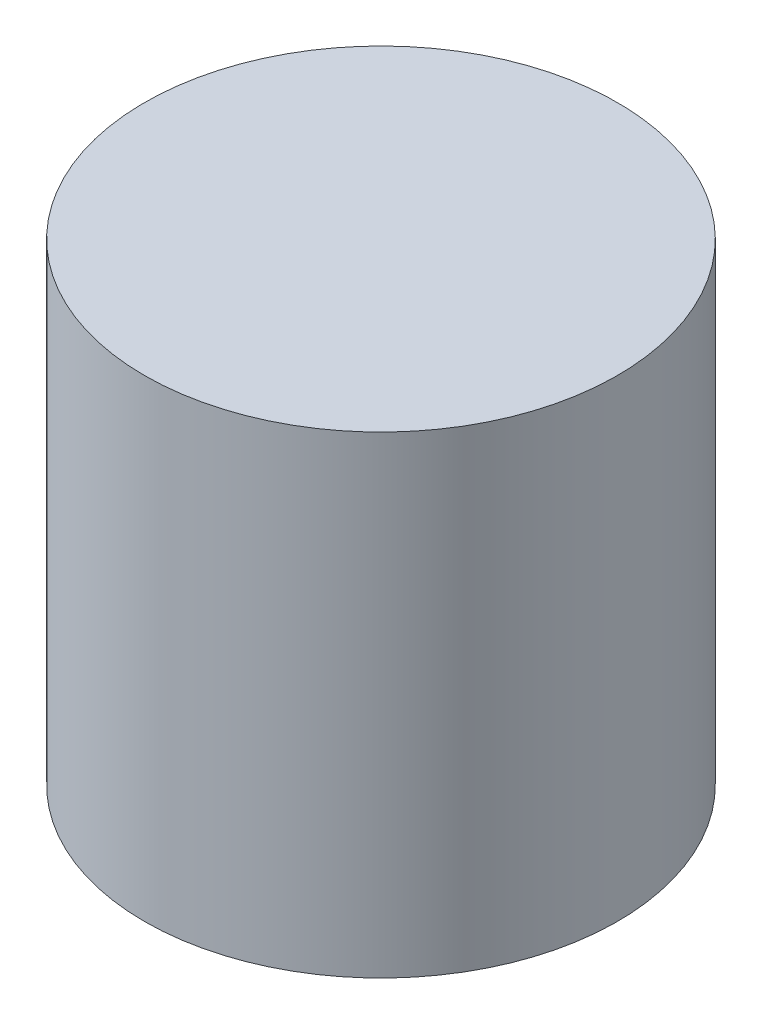
ISO-10303-21;
HEADER;
FILE_DESCRIPTION(('STEP AP214'),'2;1');
FILE_NAME('part.step','',(''),(''),'','','');
FILE_SCHEMA(('AUTOMOTIVE_DESIGN { 1 0 10303 214 1 1 1 1 }'));
ENDSEC;
DATA;
#1=APPLICATION_CONTEXT('core data for automotive mechanical design processes');
#2=APPLICATION_PROTOCOL_DEFINITION('international standard','automotive_design',2000,#1);
#3=PRODUCT_CONTEXT('',#1,'mechanical');
#4=PRODUCT('Part','Part','',(#3));
#5=PRODUCT_RELATED_PRODUCT_CATEGORY('part','',(#4));
#6=PRODUCT_DEFINITION_FORMATION('','',#4);
#7=PRODUCT_DEFINITION_CONTEXT('part definition',#1,'design');
#8=PRODUCT_DEFINITION('design','',#6,#7);
#9=PRODUCT_DEFINITION_SHAPE('','',#8);
#10=(LENGTH_UNIT() NAMED_UNIT(*) SI_UNIT(.MILLI.,.METRE.));
#11=(NAMED_UNIT(*) PLANE_ANGLE_UNIT() SI_UNIT($,.RADIAN.));
#12=(NAMED_UNIT(*) SI_UNIT($,.STERADIAN.) SOLID_ANGLE_UNIT());
#13=UNCERTAINTY_MEASURE_WITH_UNIT(LENGTH_MEASURE(1.E-05),#10,'distance_accuracy_value','');
#14=(GEOMETRIC_REPRESENTATION_CONTEXT(3) GLOBAL_UNCERTAINTY_ASSIGNED_CONTEXT((#13)) GLOBAL_UNIT_ASSIGNED_CONTEXT((#10,
#11,#12)) REPRESENTATION_CONTEXT('',''));
#15=CARTESIAN_POINT('',(0.,0.,0.));
#16=DIRECTION('',(0.,0.,1.));
#17=DIRECTION('',(1.,0.,0.));
#18=AXIS2_PLACEMENT_3D('',#15,#16,#17);
#19=CARTESIAN_POINT('',(0.,0.,0.));
#20=DIRECTION('',(0.,1.,0.));
#21=DIRECTION('',(0.,0.,1.));
#22=AXIS2_PLACEMENT_3D('',#19,#20,#21);
#23=PLANE('',#22);
#24=CARTESIAN_POINT('',(0.,0.,0.));
#25=DIRECTION('',(0.,1.,0.));
#26=DIRECTION('',(0.,0.,1.));
#27=AXIS2_PLACEMENT_3D('',#24,#25,#26);
#28=CIRCLE('',#27,2.);
#29=CARTESIAN_POINT('',(0.,0.,2.));
#30=VERTEX_POINT('',#29);
#31=EDGE_CURVE('E10',#30,#30,#28,.T.);
#32=ORIENTED_EDGE('',*,*,#31,.F.);
#33=EDGE_LOOP('',(#32));
#34=FACE_BOUND('',#33,.T.);
#35=CARTESIAN_POINT('',(0.,0.,0.));
#36=DIRECTION('',(0.,1.,0.));
#37=DIRECTION('',(0.,0.,1.));
#38=AXIS2_PLACEMENT_3D('',#35,#36,#37);
#39=CIRCLE('',#38,0.925);
#40=CARTESIAN_POINT('',(0.,0.,0.925));
#41=VERTEX_POINT('',#40);
#42=EDGE_CURVE('E42',#41,#41,#39,.T.);
#43=ORIENTED_EDGE('',*,*,#42,.T.);
#44=EDGE_LOOP('',(#43));
#45=FACE_BOUND('',#44,.T.);
#46=ADVANCED_FACE('F35',(#34,#45),#23,.F.);
#47=CARTESIAN_POINT('',(0.,3.,0.));
#48=DIRECTION('',(0.,-1.,0.));
#49=DIRECTION('',(0.,0.,-1.));
#50=AXIS2_PLACEMENT_3D('',#47,#48,#49);
#51=CYLINDRICAL_SURFACE('',#50,2.);
#52=ORIENTED_EDGE('',*,*,#31,.T.);
#53=EDGE_LOOP('',(#52));
#54=FACE_BOUND('',#53,.T.);
#55=CARTESIAN_POINT('',(0.,4.,0.));
#56=DIRECTION('',(0.,1.,0.));
#57=DIRECTION('',(0.,0.,1.));
#58=AXIS2_PLACEMENT_3D('',#55,#56,#57);
#59=CIRCLE('',#58,2.);
#60=CARTESIAN_POINT('',(0.,4.,2.));
#61=VERTEX_POINT('',#60);
#62=EDGE_CURVE('E50',#61,#61,#59,.T.);
#63=ORIENTED_EDGE('',*,*,#62,.F.);
#64=EDGE_LOOP('',(#63));
#65=FACE_BOUND('',#64,.T.);
#66=ADVANCED_FACE('F37',(#54,#65),#51,.T.);
#67=CARTESIAN_POINT('',(0.,3.,0.));
#68=DIRECTION('',(0.,-1.,0.));
#69=DIRECTION('',(0.,0.,-1.));
#70=AXIS2_PLACEMENT_3D('',#67,#68,#69);
#71=CYLINDRICAL_SURFACE('',#70,0.925);
#72=CARTESIAN_POINT('',(0.,3.,0.));
#73=DIRECTION('',(0.,1.,0.));
#74=DIRECTION('',(0.,0.,1.));
#75=AXIS2_PLACEMENT_3D('',#72,#73,#74);
#76=CIRCLE('',#75,0.925);
#77=CARTESIAN_POINT('',(0.,3.,0.925));
#78=VERTEX_POINT('',#77);
#79=EDGE_CURVE('E46',#78,#78,#76,.T.);
#80=ORIENTED_EDGE('',*,*,#79,.T.);
#81=EDGE_LOOP('',(#80));
#82=FACE_BOUND('',#81,.T.);
#83=ORIENTED_EDGE('',*,*,#42,.F.);
#84=EDGE_LOOP('',(#83));
#85=FACE_BOUND('',#84,.T.);
#86=ADVANCED_FACE('F59',(#82,#85),#71,.F.);
#87=CARTESIAN_POINT('',(0.,3.,0.));
#88=DIRECTION('',(0.,1.,0.));
#89=DIRECTION('',(0.,0.,1.));
#90=AXIS2_PLACEMENT_3D('',#87,#88,#89);
#91=PLANE('',#90);
#92=ORIENTED_EDGE('',*,*,#79,.F.);
#93=EDGE_LOOP('',(#92));
#94=FACE_BOUND('',#93,.T.);
#95=ADVANCED_FACE('F64',(#94),#91,.F.);
#96=CARTESIAN_POINT('',(0.,4.,0.));
#97=DIRECTION('',(0.,1.,0.));
#98=DIRECTION('',(0.,0.,1.));
#99=AXIS2_PLACEMENT_3D('',#96,#97,#98);
#100=PLANE('',#99);
#101=ORIENTED_EDGE('',*,*,#62,.T.);
#102=EDGE_LOOP('',(#101));
#103=FACE_BOUND('',#102,.T.);
#104=ADVANCED_FACE('F56',(#103),#100,.T.);
#105=CLOSED_SHELL('',(#46,#66,#86,#95,#104));
#106=MANIFOLD_SOLID_BREP('B2',#105);
#107=ADVANCED_BREP_SHAPE_REPRESENTATION('',(#18,#106),#14);
#108=SHAPE_DEFINITION_REPRESENTATION(#9,#107);
ENDSEC;
END-ISO-10303-21;
